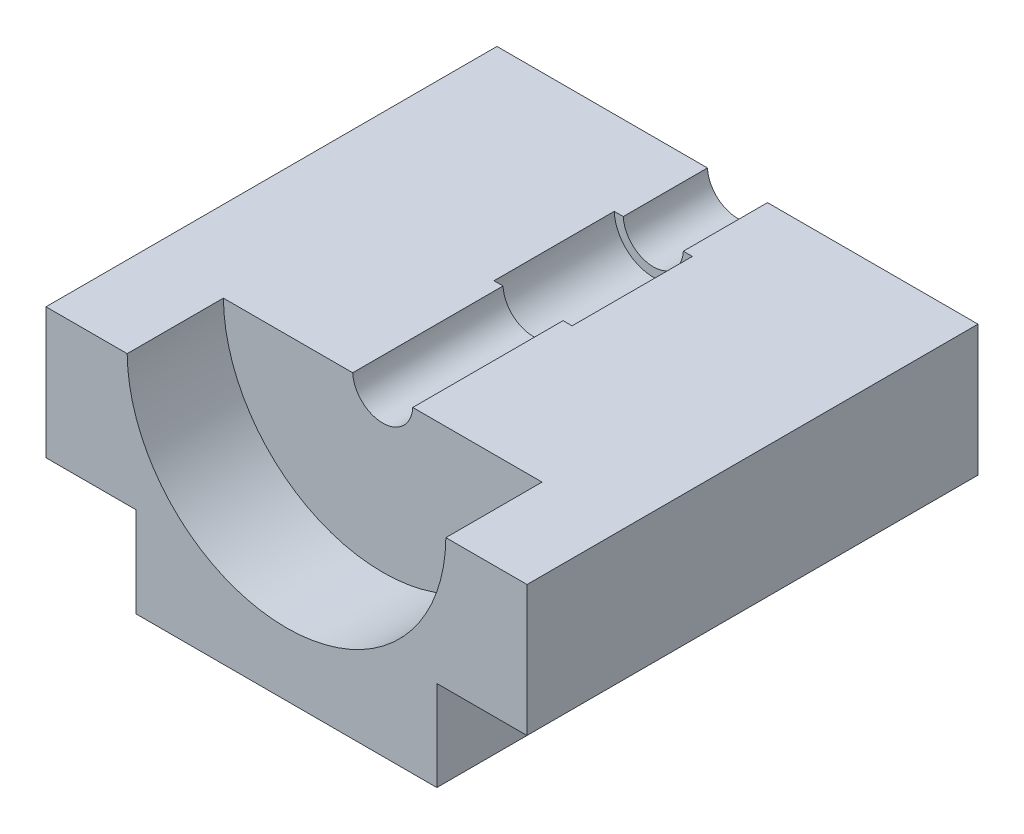
ISO-10303-21;
HEADER;
FILE_DESCRIPTION(('STEP AP214'),'2;1');
FILE_NAME('part.step','',(''),(''),'','','');
FILE_SCHEMA(('AUTOMOTIVE_DESIGN { 1 0 10303 214 1 1 1 1 }'));
ENDSEC;
DATA;
#1=APPLICATION_CONTEXT('core data for automotive mechanical design processes');
#2=APPLICATION_PROTOCOL_DEFINITION('international standard','automotive_design',2000,#1);
#3=PRODUCT_CONTEXT('',#1,'mechanical');
#4=PRODUCT('Part','Part','',(#3));
#5=PRODUCT_RELATED_PRODUCT_CATEGORY('part','',(#4));
#6=PRODUCT_DEFINITION_FORMATION('','',#4);
#7=PRODUCT_DEFINITION_CONTEXT('part definition',#1,'design');
#8=PRODUCT_DEFINITION('design','',#6,#7);
#9=PRODUCT_DEFINITION_SHAPE('','',#8);
#10=(LENGTH_UNIT() NAMED_UNIT(*) SI_UNIT(.MILLI.,.METRE.));
#11=(NAMED_UNIT(*) PLANE_ANGLE_UNIT() SI_UNIT($,.RADIAN.));
#12=(NAMED_UNIT(*) SI_UNIT($,.STERADIAN.) SOLID_ANGLE_UNIT());
#13=UNCERTAINTY_MEASURE_WITH_UNIT(LENGTH_MEASURE(1.E-05),#10,'distance_accuracy_value','');
#14=(GEOMETRIC_REPRESENTATION_CONTEXT(3) GLOBAL_UNCERTAINTY_ASSIGNED_CONTEXT((#13)) GLOBAL_UNIT_ASSIGNED_CONTEXT((#10,
#11,#12)) REPRESENTATION_CONTEXT('',''));
#15=CARTESIAN_POINT('',(0.,0.,0.));
#16=DIRECTION('',(0.,0.,1.));
#17=DIRECTION('',(1.,0.,0.));
#18=AXIS2_PLACEMENT_3D('',#15,#16,#17);
#19=CARTESIAN_POINT('',(0.,-20.,-101.38477631085));
#20=DIRECTION('',(0.,0.,1.));
#21=DIRECTION('',(1.,0.,0.));
#22=AXIS2_PLACEMENT_3D('',#19,#20,#21);
#23=CYLINDRICAL_SURFACE('',#22,6.5);
#24=DIRECTION('',(0.,0.,1.));
#25=VECTOR('',#24,1.);
#26=CARTESIAN_POINT('',(6.4951905283833,-20.25,-101.38477631085));
#27=LINE('',#26,#25);
#28=CARTESIAN_POINT('',(6.4951905283833,-20.25,-69.));
#29=VERTEX_POINT('',#28);
#30=CARTESIAN_POINT('',(6.4951905283833,-20.25,-49.));
#31=VERTEX_POINT('',#30);
#32=EDGE_CURVE('E219',#29,#31,#27,.T.);
#33=ORIENTED_EDGE('',*,*,#32,.F.);
#34=CARTESIAN_POINT('',(0.,-20.,-69.));
#35=DIRECTION('',(0.,0.,-1.));
#36=DIRECTION('',(-1.,0.,0.));
#37=AXIS2_PLACEMENT_3D('',#34,#35,#36);
#38=CIRCLE('',#37,6.5);
#39=CARTESIAN_POINT('',(-6.49519052838327,-20.25,-69.));
#40=VERTEX_POINT('',#39);
#41=EDGE_CURVE('E202',#29,#40,#38,.T.);
#42=ORIENTED_EDGE('',*,*,#41,.T.);
#43=DIRECTION('',(0.,0.,1.));
#44=VECTOR('',#43,1.);
#45=CARTESIAN_POINT('',(-6.49519052838327,-20.25,-101.38477631085));
#46=LINE('',#45,#44);
#47=CARTESIAN_POINT('',(-6.49519052838327,-20.25,-49.));
#48=VERTEX_POINT('',#47);
#49=EDGE_CURVE('E233',#48,#40,#46,.F.);
#50=ORIENTED_EDGE('',*,*,#49,.F.);
#51=CARTESIAN_POINT('',(0.,-20.,-49.));
#52=DIRECTION('',(0.,0.,-1.));
#53=DIRECTION('',(-1.,0.,0.));
#54=AXIS2_PLACEMENT_3D('',#51,#52,#53);
#55=CIRCLE('',#54,6.5);
#56=EDGE_CURVE('E195',#31,#48,#55,.T.);
#57=ORIENTED_EDGE('',*,*,#56,.F.);
#58=EDGE_LOOP('',(#33,#42,#50,#57));
#59=FACE_BOUND('',#58,.T.);
#60=ADVANCED_FACE('F38',(#59),#23,.F.);
#61=CARTESIAN_POINT('',(40.,-57.,-83.));
#62=DIRECTION('',(-1.,0.,0.));
#63=DIRECTION('',(0.,0.,1.));
#64=AXIS2_PLACEMENT_3D('',#61,#62,#63);
#65=PLANE('',#64);
#66=DIRECTION('',(0.,-1.,0.));
#67=VECTOR('',#66,1.);
#68=CARTESIAN_POINT('',(40.,-57.,-8.));
#69=LINE('',#68,#67);
#70=CARTESIAN_POINT('',(40.,-20.25,-8.00000000000001));
#71=VERTEX_POINT('',#70);
#72=CARTESIAN_POINT('',(40.,-42.,-8.));
#73=VERTEX_POINT('',#72);
#74=EDGE_CURVE('E180',#71,#73,#69,.T.);
#75=ORIENTED_EDGE('',*,*,#74,.T.);
#76=DIRECTION('',(0.,0.,-1.));
#77=VECTOR('',#76,1.);
#78=CARTESIAN_POINT('',(40.,-42.,13.2132034355964));
#79=LINE('',#78,#77);
#80=CARTESIAN_POINT('',(40.,-42.,-83.));
#81=VERTEX_POINT('',#80);
#82=EDGE_CURVE('E61',#73,#81,#79,.T.);
#83=ORIENTED_EDGE('',*,*,#82,.T.);
#84=DIRECTION('',(0.,-1.,0.));
#85=VECTOR('',#84,1.);
#86=CARTESIAN_POINT('',(40.,-57.,-83.));
#87=LINE('',#86,#85);
#88=CARTESIAN_POINT('',(40.,-20.25,-83.));
#89=VERTEX_POINT('',#88);
#90=EDGE_CURVE('E176',#89,#81,#87,.T.);
#91=ORIENTED_EDGE('',*,*,#90,.F.);
#92=DIRECTION('',(0.,0.,1.));
#93=VECTOR('',#92,1.);
#94=CARTESIAN_POINT('',(40.,-20.25,-83.));
#95=LINE('',#94,#93);
#96=EDGE_CURVE('E244',#89,#71,#95,.T.);
#97=ORIENTED_EDGE('',*,*,#96,.T.);
#98=EDGE_LOOP('',(#75,#83,#91,#97));
#99=FACE_BOUND('',#98,.T.);
#100=ADVANCED_FACE('F40',(#99),#65,.F.);
#101=CARTESIAN_POINT('',(40.,-57.,-83.));
#102=DIRECTION('',(0.,1.,0.));
#103=DIRECTION('',(0.,0.,1.));
#104=AXIS2_PLACEMENT_3D('',#101,#102,#103);
#105=PLANE('',#104);
#106=DIRECTION('',(-1.,0.,0.));
#107=VECTOR('',#106,1.);
#108=CARTESIAN_POINT('',(40.,-57.,-8.));
#109=LINE('',#108,#107);
#110=CARTESIAN_POINT('',(25.,-57.,-8.));
#111=VERTEX_POINT('',#110);
#112=CARTESIAN_POINT('',(-25.,-57.,-8.));
#113=VERTEX_POINT('',#112);
#114=EDGE_CURVE('E183',#111,#113,#109,.T.);
#115=ORIENTED_EDGE('',*,*,#114,.T.);
#116=DIRECTION('',(0.,0.,-1.));
#117=VECTOR('',#116,1.);
#118=CARTESIAN_POINT('',(-25.,-57.,13.2132034355964));
#119=LINE('',#118,#117);
#120=CARTESIAN_POINT('',(-25.,-57.,-83.));
#121=VERTEX_POINT('',#120);
#122=EDGE_CURVE('E265',#113,#121,#119,.T.);
#123=ORIENTED_EDGE('',*,*,#122,.T.);
#124=DIRECTION('',(-1.,0.,0.));
#125=VECTOR('',#124,1.);
#126=CARTESIAN_POINT('',(40.,-57.,-83.));
#127=LINE('',#126,#125);
#128=CARTESIAN_POINT('',(25.,-57.,-83.));
#129=VERTEX_POINT('',#128);
#130=EDGE_CURVE('E173',#129,#121,#127,.T.);
#131=ORIENTED_EDGE('',*,*,#130,.F.);
#132=DIRECTION('',(0.,0.,-1.));
#133=VECTOR('',#132,1.);
#134=CARTESIAN_POINT('',(25.,-57.,13.2132034355964));
#135=LINE('',#134,#133);
#136=EDGE_CURVE('E253',#111,#129,#135,.T.);
#137=ORIENTED_EDGE('',*,*,#136,.F.);
#138=EDGE_LOOP('',(#115,#123,#131,#137));
#139=FACE_BOUND('',#138,.T.);
#140=ADVANCED_FACE('F290',(#139),#105,.F.);
#141=CARTESIAN_POINT('',(-40.,-57.,-83.));
#142=DIRECTION('',(1.,0.,0.));
#143=DIRECTION('',(0.,1.,0.));
#144=AXIS2_PLACEMENT_3D('',#141,#142,#143);
#145=PLANE('',#144);
#146=DIRECTION('',(0.,1.,0.));
#147=VECTOR('',#146,1.);
#148=CARTESIAN_POINT('',(-40.,-57.,-83.));
#149=LINE('',#148,#147);
#150=CARTESIAN_POINT('',(-40.,-42.,-83.));
#151=VERTEX_POINT('',#150);
#152=CARTESIAN_POINT('',(-40.,-20.25,-83.));
#153=VERTEX_POINT('',#152);
#154=EDGE_CURVE('E164',#151,#153,#149,.T.);
#155=ORIENTED_EDGE('',*,*,#154,.F.);
#156=DIRECTION('',(0.,0.,-1.));
#157=VECTOR('',#156,1.);
#158=CARTESIAN_POINT('',(-40.,-42.,13.2132034355964));
#159=LINE('',#158,#157);
#160=CARTESIAN_POINT('',(-40.,-42.,-8.));
#161=VERTEX_POINT('',#160);
#162=EDGE_CURVE('E149',#161,#151,#159,.T.);
#163=ORIENTED_EDGE('',*,*,#162,.F.);
#164=DIRECTION('',(0.,1.,0.));
#165=VECTOR('',#164,1.);
#166=CARTESIAN_POINT('',(-40.,-57.,-8.));
#167=LINE('',#166,#165);
#168=CARTESIAN_POINT('',(-40.,-20.25,-8.));
#169=VERTEX_POINT('',#168);
#170=EDGE_CURVE('E186',#161,#169,#167,.T.);
#171=ORIENTED_EDGE('',*,*,#170,.T.);
#172=DIRECTION('',(0.,0.,1.));
#173=VECTOR('',#172,1.);
#174=CARTESIAN_POINT('',(-40.,-20.25,-83.));
#175=LINE('',#174,#173);
#176=EDGE_CURVE('E172',#153,#169,#175,.T.);
#177=ORIENTED_EDGE('',*,*,#176,.F.);
#178=EDGE_LOOP('',(#155,#163,#171,#177));
#179=FACE_BOUND('',#178,.T.);
#180=ADVANCED_FACE('F170',(#179),#145,.F.);
#181=CARTESIAN_POINT('',(0.,0.,-83.));
#182=DIRECTION('',(0.,0.,-1.));
#183=DIRECTION('',(-1.,0.,0.));
#184=AXIS2_PLACEMENT_3D('',#181,#182,#183);
#185=PLANE('',#184);
#186=DIRECTION('',(0.,-1.,0.));
#187=VECTOR('',#186,1.);
#188=CARTESIAN_POINT('',(-25.,-42.,-83.));
#189=LINE('',#188,#187);
#190=CARTESIAN_POINT('',(-25.,-42.,-83.));
#191=VERTEX_POINT('',#190);
#192=EDGE_CURVE('E159',#191,#121,#189,.T.);
#193=ORIENTED_EDGE('',*,*,#192,.F.);
#194=DIRECTION('',(1.,0.,0.));
#195=VECTOR('',#194,1.);
#196=CARTESIAN_POINT('',(-40.,-42.,-83.));
#197=LINE('',#196,#195);
#198=EDGE_CURVE('E152',#151,#191,#197,.T.);
#199=ORIENTED_EDGE('',*,*,#198,.F.);
#200=ORIENTED_EDGE('',*,*,#154,.T.);
#201=DIRECTION('',(1.,0.,0.));
#202=VECTOR('',#201,1.);
#203=CARTESIAN_POINT('',(-40.,-20.25,-83.));
#204=LINE('',#203,#202);
#205=CARTESIAN_POINT('',(-4.99374608885953,-20.25,-83.));
#206=VERTEX_POINT('',#205);
#207=EDGE_CURVE('E246',#153,#206,#204,.T.);
#208=ORIENTED_EDGE('',*,*,#207,.T.);
#209=CARTESIAN_POINT('',(0.,-20.,-83.));
#210=DIRECTION('',(0.,0.,-1.));
#211=DIRECTION('',(-1.,0.,0.));
#212=AXIS2_PLACEMENT_3D('',#209,#210,#211);
#213=CIRCLE('',#212,5.);
#214=CARTESIAN_POINT('',(4.99374608885956,-20.25,-83.));
#215=VERTEX_POINT('',#214);
#216=EDGE_CURVE('E207',#215,#206,#213,.T.);
#217=ORIENTED_EDGE('',*,*,#216,.F.);
#218=EDGE_CURVE('E250',#215,#89,#204,.T.);
#219=ORIENTED_EDGE('',*,*,#218,.T.);
#220=ORIENTED_EDGE('',*,*,#90,.T.);
#221=DIRECTION('',(1.,0.,0.));
#222=VECTOR('',#221,1.);
#223=CARTESIAN_POINT('',(40.,-42.,-83.));
#224=LINE('',#223,#222);
#225=CARTESIAN_POINT('',(25.,-42.,-83.));
#226=VERTEX_POINT('',#225);
#227=EDGE_CURVE('E257',#226,#81,#224,.T.);
#228=ORIENTED_EDGE('',*,*,#227,.F.);
#229=DIRECTION('',(0.,1.,0.));
#230=VECTOR('',#229,1.);
#231=CARTESIAN_POINT('',(25.,-42.,-83.));
#232=LINE('',#231,#230);
#233=EDGE_CURVE('E167',#129,#226,#232,.T.);
#234=ORIENTED_EDGE('',*,*,#233,.F.);
#235=ORIENTED_EDGE('',*,*,#130,.T.);
#236=EDGE_LOOP('',(#193,#199,#200,#208,#217,#219,#220,#228,#234,#235));
#237=FACE_BOUND('',#236,.T.);
#238=ADVANCED_FACE('F162',(#237),#185,.T.);
#239=CARTESIAN_POINT('',(0.,-20.,-24.));
#240=DIRECTION('',(0.,0.,1.));
#241=DIRECTION('',(1.,0.,0.));
#242=AXIS2_PLACEMENT_3D('',#239,#240,#241);
#243=CYLINDRICAL_SURFACE('',#242,26.5);
#244=DIRECTION('',(0.,0.,1.));
#245=VECTOR('',#244,1.);
#246=CARTESIAN_POINT('',(26.4988207284777,-20.25,-24.));
#247=LINE('',#246,#245);
#248=CARTESIAN_POINT('',(26.4988207284777,-20.25,-24.));
#249=VERTEX_POINT('',#248);
#250=CARTESIAN_POINT('',(26.4988207284777,-20.25,-8.));
#251=VERTEX_POINT('',#250);
#252=EDGE_CURVE('E225',#249,#251,#247,.T.);
#253=ORIENTED_EDGE('',*,*,#252,.F.);
#254=CARTESIAN_POINT('',(0.,-20.,-24.));
#255=DIRECTION('',(0.,0.,-1.));
#256=DIRECTION('',(-1.,0.,0.));
#257=AXIS2_PLACEMENT_3D('',#254,#255,#256);
#258=CIRCLE('',#257,26.5);
#259=CARTESIAN_POINT('',(-26.4988207284777,-20.25,-24.));
#260=VERTEX_POINT('',#259);
#261=EDGE_CURVE('E184',#249,#260,#258,.T.);
#262=ORIENTED_EDGE('',*,*,#261,.T.);
#263=DIRECTION('',(0.,0.,1.));
#264=VECTOR('',#263,1.);
#265=CARTESIAN_POINT('',(-26.4988207284777,-20.25,-24.));
#266=LINE('',#265,#264);
#267=CARTESIAN_POINT('',(-26.4988207284777,-20.25,-8.));
#268=VERTEX_POINT('',#267);
#269=EDGE_CURVE('E242',#268,#260,#266,.F.);
#270=ORIENTED_EDGE('',*,*,#269,.F.);
#271=CARTESIAN_POINT('',(0.,-20.,-8.));
#272=DIRECTION('',(0.,0.,-1.));
#273=DIRECTION('',(-1.,0.,0.));
#274=AXIS2_PLACEMENT_3D('',#271,#272,#273);
#275=CIRCLE('',#274,26.5);
#276=EDGE_CURVE('E192',#251,#268,#275,.T.);
#277=ORIENTED_EDGE('',*,*,#276,.F.);
#278=EDGE_LOOP('',(#253,#262,#270,#277));
#279=FACE_BOUND('',#278,.T.);
#280=ADVANCED_FACE('F297',(#279),#243,.F.);
#281=CARTESIAN_POINT('',(0.,-20.,-24.));
#282=DIRECTION('',(0.,0.,-1.));
#283=DIRECTION('',(-1.,0.,0.));
#284=AXIS2_PLACEMENT_3D('',#281,#282,#283);
#285=PLANE('',#284);
#286=ORIENTED_EDGE('',*,*,#261,.F.);
#287=DIRECTION('',(-1.,0.,0.));
#288=VECTOR('',#287,1.);
#289=CARTESIAN_POINT('',(0.,-20.25,-24.));
#290=LINE('',#289,#288);
#291=CARTESIAN_POINT('',(4.99374608885956,-20.25,-24.));
#292=VERTEX_POINT('',#291);
#293=EDGE_CURVE('E224',#249,#292,#290,.T.);
#294=ORIENTED_EDGE('',*,*,#293,.T.);
#295=CARTESIAN_POINT('',(0.,-20.,-24.));
#296=DIRECTION('',(0.,0.,-1.));
#297=DIRECTION('',(-1.,0.,0.));
#298=AXIS2_PLACEMENT_3D('',#295,#296,#297);
#299=CIRCLE('',#298,5.);
#300=CARTESIAN_POINT('',(-4.99374608885953,-20.25,-24.));
#301=VERTEX_POINT('',#300);
#302=EDGE_CURVE('E198',#292,#301,#299,.T.);
#303=ORIENTED_EDGE('',*,*,#302,.T.);
#304=EDGE_CURVE('E239',#301,#260,#290,.T.);
#305=ORIENTED_EDGE('',*,*,#304,.T.);
#306=EDGE_LOOP('',(#286,#294,#303,#305));
#307=FACE_BOUND('',#306,.T.);
#308=ADVANCED_FACE('F301',(#307),#285,.F.);
#309=CARTESIAN_POINT('',(0.,-20.,-49.));
#310=DIRECTION('',(0.,0.,1.));
#311=DIRECTION('',(1.,0.,0.));
#312=AXIS2_PLACEMENT_3D('',#309,#310,#311);
#313=CYLINDRICAL_SURFACE('',#312,5.);
#314=DIRECTION('',(0.,0.,1.));
#315=VECTOR('',#314,1.);
#316=CARTESIAN_POINT('',(4.99374608885956,-20.25,-49.));
#317=LINE('',#316,#315);
#318=CARTESIAN_POINT('',(4.99374608885956,-20.25,-49.));
#319=VERTEX_POINT('',#318);
#320=EDGE_CURVE('E222',#319,#292,#317,.T.);
#321=ORIENTED_EDGE('',*,*,#320,.F.);
#322=CARTESIAN_POINT('',(0.,-20.,-49.));
#323=DIRECTION('',(0.,0.,-1.));
#324=DIRECTION('',(-1.,0.,0.));
#325=AXIS2_PLACEMENT_3D('',#322,#323,#324);
#326=CIRCLE('',#325,5.);
#327=CARTESIAN_POINT('',(-4.99374608885953,-20.25,-49.));
#328=VERTEX_POINT('',#327);
#329=EDGE_CURVE('E201',#319,#328,#326,.T.);
#330=ORIENTED_EDGE('',*,*,#329,.T.);
#331=DIRECTION('',(0.,0.,1.));
#332=VECTOR('',#331,1.);
#333=CARTESIAN_POINT('',(-4.99374608885953,-20.25,-49.));
#334=LINE('',#333,#332);
#335=EDGE_CURVE('E237',#301,#328,#334,.F.);
#336=ORIENTED_EDGE('',*,*,#335,.F.);
#337=ORIENTED_EDGE('',*,*,#302,.F.);
#338=EDGE_LOOP('',(#321,#330,#336,#337));
#339=FACE_BOUND('',#338,.T.);
#340=ADVANCED_FACE('F307',(#339),#313,.F.);
#341=CARTESIAN_POINT('',(0.,-20.,-49.));
#342=DIRECTION('',(0.,0.,-1.));
#343=DIRECTION('',(-1.,0.,0.));
#344=AXIS2_PLACEMENT_3D('',#341,#342,#343);
#345=PLANE('',#344);
#346=DIRECTION('',(-1.,0.,0.));
#347=VECTOR('',#346,1.);
#348=CARTESIAN_POINT('',(0.,-20.25,-49.));
#349=LINE('',#348,#347);
#350=EDGE_CURVE('E221',#31,#319,#349,.T.);
#351=ORIENTED_EDGE('',*,*,#350,.F.);
#352=ORIENTED_EDGE('',*,*,#56,.T.);
#353=EDGE_CURVE('E235',#328,#48,#349,.T.);
#354=ORIENTED_EDGE('',*,*,#353,.F.);
#355=ORIENTED_EDGE('',*,*,#329,.F.);
#356=EDGE_LOOP('',(#351,#352,#354,#355));
#357=FACE_BOUND('',#356,.T.);
#358=ADVANCED_FACE('F311',(#357),#345,.T.);
#359=CARTESIAN_POINT('',(0.,-20.,-69.));
#360=DIRECTION('',(0.,0.,-1.));
#361=DIRECTION('',(-1.,0.,0.));
#362=AXIS2_PLACEMENT_3D('',#359,#360,#361);
#363=CYLINDRICAL_SURFACE('',#362,5.);
#364=ORIENTED_EDGE('',*,*,#216,.T.);
#365=DIRECTION('',(0.,0.,-1.));
#366=VECTOR('',#365,1.);
#367=CARTESIAN_POINT('',(-4.99374608885953,-20.25,-69.));
#368=LINE('',#367,#366);
#369=CARTESIAN_POINT('',(-4.99374608885953,-20.25,-69.));
#370=VERTEX_POINT('',#369);
#371=EDGE_CURVE('E227',#206,#370,#368,.F.);
#372=ORIENTED_EDGE('',*,*,#371,.T.);
#373=CARTESIAN_POINT('',(0.,-20.,-69.));
#374=DIRECTION('',(0.,0.,-1.));
#375=DIRECTION('',(-1.,0.,0.));
#376=AXIS2_PLACEMENT_3D('',#373,#374,#375);
#377=CIRCLE('',#376,5.);
#378=CARTESIAN_POINT('',(4.99374608885956,-20.25,-69.));
#379=VERTEX_POINT('',#378);
#380=EDGE_CURVE('E210',#379,#370,#377,.T.);
#381=ORIENTED_EDGE('',*,*,#380,.F.);
#382=DIRECTION('',(0.,0.,-1.));
#383=VECTOR('',#382,1.);
#384=CARTESIAN_POINT('',(4.99374608885956,-20.25,-69.));
#385=LINE('',#384,#383);
#386=EDGE_CURVE('E211',#379,#215,#385,.T.);
#387=ORIENTED_EDGE('',*,*,#386,.T.);
#388=EDGE_LOOP('',(#364,#372,#381,#387));
#389=FACE_BOUND('',#388,.T.);
#390=ADVANCED_FACE('F322',(#389),#363,.F.);
#391=CARTESIAN_POINT('',(0.,-20.,-69.));
#392=DIRECTION('',(0.,0.,-1.));
#393=DIRECTION('',(-1.,0.,0.));
#394=AXIS2_PLACEMENT_3D('',#391,#392,#393);
#395=PLANE('',#394);
#396=ORIENTED_EDGE('',*,*,#41,.F.);
#397=DIRECTION('',(-1.,0.,0.));
#398=VECTOR('',#397,1.);
#399=CARTESIAN_POINT('',(0.,-20.25,-69.));
#400=LINE('',#399,#398);
#401=EDGE_CURVE('E218',#29,#379,#400,.T.);
#402=ORIENTED_EDGE('',*,*,#401,.T.);
#403=ORIENTED_EDGE('',*,*,#380,.T.);
#404=EDGE_CURVE('E230',#370,#40,#400,.T.);
#405=ORIENTED_EDGE('',*,*,#404,.T.);
#406=EDGE_LOOP('',(#396,#402,#403,#405));
#407=FACE_BOUND('',#406,.T.);
#408=ADVANCED_FACE('F319',(#407),#395,.F.);
#409=CARTESIAN_POINT('',(-52.5,35.,-8.));
#410=DIRECTION('',(0.,0.,-1.));
#411=DIRECTION('',(-1.,0.,0.));
#412=AXIS2_PLACEMENT_3D('',#409,#410,#411);
#413=PLANE('',#412);
#414=DIRECTION('',(-1.,0.,0.));
#415=VECTOR('',#414,1.);
#416=CARTESIAN_POINT('',(-40.,-42.,-8.));
#417=LINE('',#416,#415);
#418=CARTESIAN_POINT('',(-25.,-42.,-8.));
#419=VERTEX_POINT('',#418);
#420=EDGE_CURVE('E155',#419,#161,#417,.T.);
#421=ORIENTED_EDGE('',*,*,#420,.F.);
#422=DIRECTION('',(0.,1.,0.));
#423=VECTOR('',#422,1.);
#424=CARTESIAN_POINT('',(-25.,-42.,-8.));
#425=LINE('',#424,#423);
#426=EDGE_CURVE('E269',#113,#419,#425,.T.);
#427=ORIENTED_EDGE('',*,*,#426,.F.);
#428=ORIENTED_EDGE('',*,*,#114,.F.);
#429=DIRECTION('',(0.,-1.,0.));
#430=VECTOR('',#429,1.);
#431=CARTESIAN_POINT('',(25.,-42.,-8.));
#432=LINE('',#431,#430);
#433=CARTESIAN_POINT('',(25.,-42.,-8.));
#434=VERTEX_POINT('',#433);
#435=EDGE_CURVE('E251',#434,#111,#432,.T.);
#436=ORIENTED_EDGE('',*,*,#435,.F.);
#437=DIRECTION('',(-1.,0.,0.));
#438=VECTOR('',#437,1.);
#439=CARTESIAN_POINT('',(40.,-42.,-8.));
#440=LINE('',#439,#438);
#441=EDGE_CURVE('E254',#73,#434,#440,.T.);
#442=ORIENTED_EDGE('',*,*,#441,.F.);
#443=ORIENTED_EDGE('',*,*,#74,.F.);
#444=DIRECTION('',(-1.,0.,0.));
#445=VECTOR('',#444,1.);
#446=CARTESIAN_POINT('',(-52.5,-20.25,-8.));
#447=LINE('',#446,#445);
#448=EDGE_CURVE('E11',#71,#251,#447,.T.);
#449=ORIENTED_EDGE('',*,*,#448,.T.);
#450=ORIENTED_EDGE('',*,*,#276,.T.);
#451=EDGE_CURVE('E42',#268,#169,#447,.T.);
#452=ORIENTED_EDGE('',*,*,#451,.T.);
#453=ORIENTED_EDGE('',*,*,#170,.F.);
#454=EDGE_LOOP('',(#421,#427,#428,#436,#442,#443,#449,#450,#452,#453));
#455=FACE_BOUND('',#454,.T.);
#456=ADVANCED_FACE('F278',(#455),#413,.F.);
#457=CARTESIAN_POINT('',(-40.,-20.25,-83.));
#458=DIRECTION('',(0.,-1.,0.));
#459=DIRECTION('',(0.,0.,-1.));
#460=AXIS2_PLACEMENT_3D('',#457,#458,#459);
#461=PLANE('',#460);
#462=ORIENTED_EDGE('',*,*,#207,.F.);
#463=ORIENTED_EDGE('',*,*,#176,.T.);
#464=ORIENTED_EDGE('',*,*,#451,.F.);
#465=ORIENTED_EDGE('',*,*,#269,.T.);
#466=ORIENTED_EDGE('',*,*,#304,.F.);
#467=ORIENTED_EDGE('',*,*,#335,.T.);
#468=ORIENTED_EDGE('',*,*,#353,.T.);
#469=ORIENTED_EDGE('',*,*,#49,.T.);
#470=ORIENTED_EDGE('',*,*,#404,.F.);
#471=ORIENTED_EDGE('',*,*,#371,.F.);
#472=EDGE_LOOP('',(#462,#463,#464,#465,#466,#467,#468,#469,#470,#471));
#473=FACE_BOUND('',#472,.T.);
#474=ADVANCED_FACE('F294',(#473),#461,.F.);
#475=ORIENTED_EDGE('',*,*,#401,.F.);
#476=ORIENTED_EDGE('',*,*,#32,.T.);
#477=ORIENTED_EDGE('',*,*,#350,.T.);
#478=ORIENTED_EDGE('',*,*,#320,.T.);
#479=ORIENTED_EDGE('',*,*,#293,.F.);
#480=ORIENTED_EDGE('',*,*,#252,.T.);
#481=ORIENTED_EDGE('',*,*,#448,.F.);
#482=ORIENTED_EDGE('',*,*,#96,.F.);
#483=ORIENTED_EDGE('',*,*,#218,.F.);
#484=ORIENTED_EDGE('',*,*,#386,.F.);
#485=EDGE_LOOP('',(#475,#476,#477,#478,#479,#480,#481,#482,#483,#484));
#486=FACE_BOUND('',#485,.T.);
#487=ADVANCED_FACE('F323',(#486),#461,.F.);
#488=CARTESIAN_POINT('',(25.,-42.,13.2132034355964));
#489=DIRECTION('',(-1.,0.,0.));
#490=DIRECTION('',(0.,-1.,0.));
#491=AXIS2_PLACEMENT_3D('',#488,#489,#490);
#492=PLANE('',#491);
#493=ORIENTED_EDGE('',*,*,#435,.T.);
#494=ORIENTED_EDGE('',*,*,#136,.T.);
#495=ORIENTED_EDGE('',*,*,#233,.T.);
#496=DIRECTION('',(0.,0.,-1.));
#497=VECTOR('',#496,1.);
#498=CARTESIAN_POINT('',(25.,-42.,13.2132034355964));
#499=LINE('',#498,#497);
#500=EDGE_CURVE('E259',#434,#226,#499,.T.);
#501=ORIENTED_EDGE('',*,*,#500,.F.);
#502=EDGE_LOOP('',(#493,#494,#495,#501));
#503=FACE_BOUND('',#502,.T.);
#504=ADVANCED_FACE('F285',(#503),#492,.F.);
#505=CARTESIAN_POINT('',(40.,-42.,13.2132034355964));
#506=DIRECTION('',(0.,1.,0.));
#507=DIRECTION('',(0.,0.,1.));
#508=AXIS2_PLACEMENT_3D('',#505,#506,#507);
#509=PLANE('',#508);
#510=ORIENTED_EDGE('',*,*,#441,.T.);
#511=ORIENTED_EDGE('',*,*,#500,.T.);
#512=ORIENTED_EDGE('',*,*,#227,.T.);
#513=ORIENTED_EDGE('',*,*,#82,.F.);
#514=EDGE_LOOP('',(#510,#511,#512,#513));
#515=FACE_BOUND('',#514,.T.);
#516=ADVANCED_FACE('F283',(#515),#509,.F.);
#517=CARTESIAN_POINT('',(-25.,-42.,13.2132034355964));
#518=DIRECTION('',(1.,0.,0.));
#519=DIRECTION('',(0.,1.,0.));
#520=AXIS2_PLACEMENT_3D('',#517,#518,#519);
#521=PLANE('',#520);
#522=ORIENTED_EDGE('',*,*,#426,.T.);
#523=DIRECTION('',(0.,0.,-1.));
#524=VECTOR('',#523,1.);
#525=CARTESIAN_POINT('',(-25.,-42.,13.2132034355964));
#526=LINE('',#525,#524);
#527=EDGE_CURVE('E53',#419,#191,#526,.T.);
#528=ORIENTED_EDGE('',*,*,#527,.T.);
#529=ORIENTED_EDGE('',*,*,#192,.T.);
#530=ORIENTED_EDGE('',*,*,#122,.F.);
#531=EDGE_LOOP('',(#522,#528,#529,#530));
#532=FACE_BOUND('',#531,.T.);
#533=ADVANCED_FACE('F291',(#532),#521,.F.);
#534=CARTESIAN_POINT('',(-40.,-42.,13.2132034355964));
#535=DIRECTION('',(0.,1.,0.));
#536=DIRECTION('',(0.,0.,1.));
#537=AXIS2_PLACEMENT_3D('',#534,#535,#536);
#538=PLANE('',#537);
#539=ORIENTED_EDGE('',*,*,#420,.T.);
#540=ORIENTED_EDGE('',*,*,#162,.T.);
#541=ORIENTED_EDGE('',*,*,#198,.T.);
#542=ORIENTED_EDGE('',*,*,#527,.F.);
#543=EDGE_LOOP('',(#539,#540,#541,#542));
#544=FACE_BOUND('',#543,.T.);
#545=ADVANCED_FACE('F151',(#544),#538,.F.);
#546=CLOSED_SHELL('',(#60,#100,#140,#180,#238,#280,#308,#340,#358,#390,#408,#456,#474,#487,#504,
#516,#533,#545));
#547=MANIFOLD_SOLID_BREP('B2',#546);
#548=ADVANCED_BREP_SHAPE_REPRESENTATION('',(#18,#547),#14);
#549=SHAPE_DEFINITION_REPRESENTATION(#9,#548);
ENDSEC;
END-ISO-10303-21;
